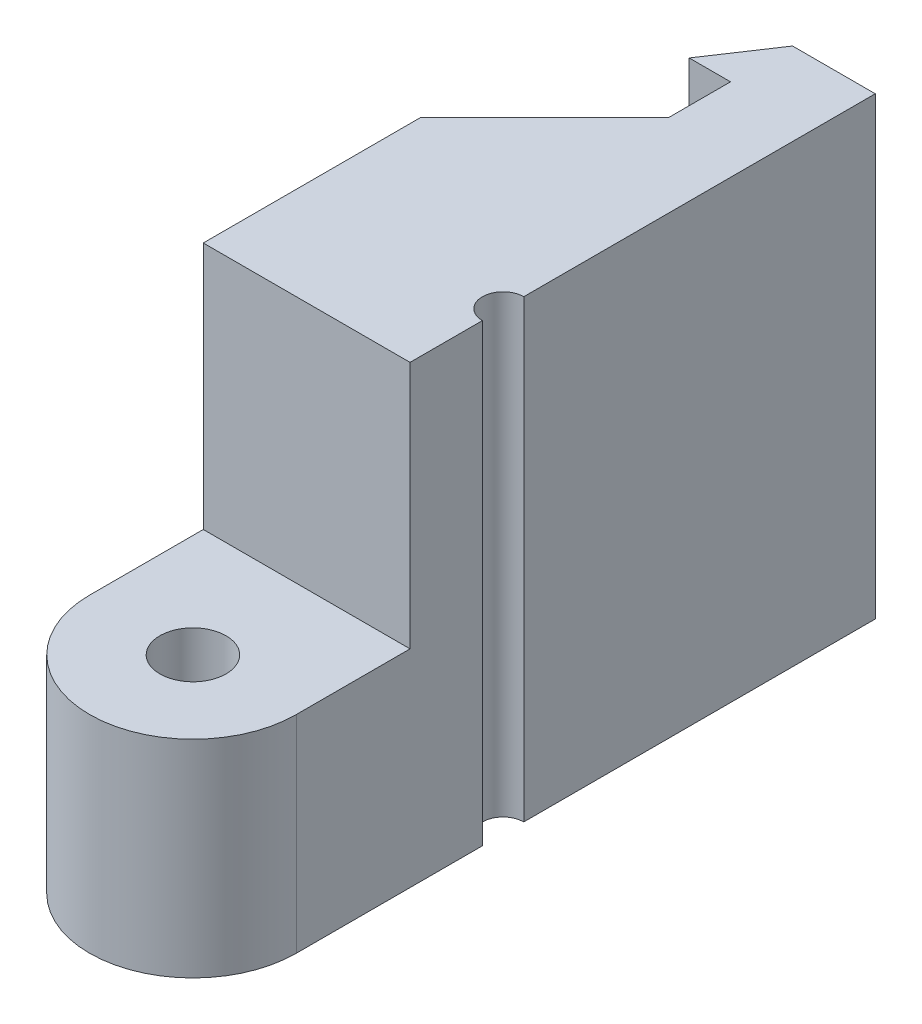
ISO-10303-21;
HEADER;
FILE_DESCRIPTION(('STEP AP214'),'2;1');
FILE_NAME('part.step','',(''),(''),'','','');
FILE_SCHEMA(('AUTOMOTIVE_DESIGN { 1 0 10303 214 1 1 1 1 }'));
ENDSEC;
DATA;
#1=APPLICATION_CONTEXT('core data for automotive mechanical design processes');
#2=APPLICATION_PROTOCOL_DEFINITION('international standard','automotive_design',2000,#1);
#3=PRODUCT_CONTEXT('',#1,'mechanical');
#4=PRODUCT('Part','Part','',(#3));
#5=PRODUCT_RELATED_PRODUCT_CATEGORY('part','',(#4));
#6=PRODUCT_DEFINITION_FORMATION('','',#4);
#7=PRODUCT_DEFINITION_CONTEXT('part definition',#1,'design');
#8=PRODUCT_DEFINITION('design','',#6,#7);
#9=PRODUCT_DEFINITION_SHAPE('','',#8);
#10=(LENGTH_UNIT() NAMED_UNIT(*) SI_UNIT(.MILLI.,.METRE.));
#11=(NAMED_UNIT(*) PLANE_ANGLE_UNIT() SI_UNIT($,.RADIAN.));
#12=(NAMED_UNIT(*) SI_UNIT($,.STERADIAN.) SOLID_ANGLE_UNIT());
#13=UNCERTAINTY_MEASURE_WITH_UNIT(LENGTH_MEASURE(1.E-05),#10,'distance_accuracy_value','');
#14=(GEOMETRIC_REPRESENTATION_CONTEXT(3) GLOBAL_UNCERTAINTY_ASSIGNED_CONTEXT((#13)) GLOBAL_UNIT_ASSIGNED_CONTEXT((#10,
#11,#12)) REPRESENTATION_CONTEXT('',''));
#15=CARTESIAN_POINT('',(0.,0.,0.));
#16=DIRECTION('',(0.,0.,1.));
#17=DIRECTION('',(1.,0.,0.));
#18=AXIS2_PLACEMENT_3D('',#15,#16,#17);
#19=CARTESIAN_POINT('',(5.,10.,-10.));
#20=DIRECTION('',(0.,-1.,0.));
#21=DIRECTION('',(0.,0.,-1.));
#22=AXIS2_PLACEMENT_3D('',#19,#20,#21);
#23=CYLINDRICAL_SURFACE('',#22,0.999999999999997);
#24=CARTESIAN_POINT('',(5.,0.,-10.));
#25=DIRECTION('',(0.,1.,0.));
#26=DIRECTION('',(0.,0.,1.));
#27=AXIS2_PLACEMENT_3D('',#24,#25,#26);
#28=CIRCLE('',#27,0.999999999999997);
#29=CARTESIAN_POINT('',(5.,0.,-11.));
#30=VERTEX_POINT('',#29);
#31=CARTESIAN_POINT('',(5.,0.,-9.));
#32=VERTEX_POINT('',#31);
#33=EDGE_CURVE('E194',#30,#32,#28,.T.);
#34=ORIENTED_EDGE('',*,*,#33,.F.);
#35=DIRECTION('',(0.,-1.,0.));
#36=VECTOR('',#35,1.);
#37=CARTESIAN_POINT('',(5.,10.,-11.));
#38=LINE('',#37,#36);
#39=CARTESIAN_POINT('',(5.,22.,-11.));
#40=VERTEX_POINT('',#39);
#41=EDGE_CURVE('E226',#40,#30,#38,.T.);
#42=ORIENTED_EDGE('',*,*,#41,.F.);
#43=CARTESIAN_POINT('',(5.,22.,-10.));
#44=DIRECTION('',(0.,-1.,0.));
#45=DIRECTION('',(0.,0.,1.));
#46=AXIS2_PLACEMENT_3D('',#43,#44,#45);
#47=CIRCLE('',#46,0.999999999999997);
#48=CARTESIAN_POINT('',(5.,22.,-9.));
#49=VERTEX_POINT('',#48);
#50=EDGE_CURVE('E142',#49,#40,#47,.T.);
#51=ORIENTED_EDGE('',*,*,#50,.F.);
#52=DIRECTION('',(0.,-1.,0.));
#53=VECTOR('',#52,1.);
#54=CARTESIAN_POINT('',(5.,10.,-9.));
#55=LINE('',#54,#53);
#56=EDGE_CURVE('E206',#49,#32,#55,.T.);
#57=ORIENTED_EDGE('',*,*,#56,.T.);
#58=EDGE_LOOP('',(#34,#42,#51,#57));
#59=FACE_BOUND('',#58,.T.);
#60=ADVANCED_FACE('F45',(#59),#23,.F.);
#61=CARTESIAN_POINT('',(5.,10.,0.));
#62=DIRECTION('',(-1.,0.,0.));
#63=DIRECTION('',(0.,0.,1.));
#64=AXIS2_PLACEMENT_3D('',#61,#62,#63);
#65=PLANE('',#64);
#66=DIRECTION('',(0.,0.,-1.));
#67=VECTOR('',#66,1.);
#68=CARTESIAN_POINT('',(5.,0.,0.));
#69=LINE('',#68,#67);
#70=CARTESIAN_POINT('',(5.,0.,-28.));
#71=VERTEX_POINT('',#70);
#72=EDGE_CURVE('E150',#30,#71,#69,.T.);
#73=ORIENTED_EDGE('',*,*,#72,.T.);
#74=DIRECTION('',(0.,1.,0.));
#75=VECTOR('',#74,1.);
#76=CARTESIAN_POINT('',(5.,-8.48528137423857,-28.));
#77=LINE('',#76,#75);
#78=CARTESIAN_POINT('',(5.,22.,-28.));
#79=VERTEX_POINT('',#78);
#80=EDGE_CURVE('E147',#71,#79,#77,.T.);
#81=ORIENTED_EDGE('',*,*,#80,.T.);
#82=DIRECTION('',(0.,0.,-1.));
#83=VECTOR('',#82,1.);
#84=CARTESIAN_POINT('',(5.,22.,-11.));
#85=LINE('',#84,#83);
#86=EDGE_CURVE('E134',#40,#79,#85,.T.);
#87=ORIENTED_EDGE('',*,*,#86,.F.);
#88=ORIENTED_EDGE('',*,*,#41,.T.);
#89=EDGE_LOOP('',(#73,#81,#87,#88));
#90=FACE_BOUND('',#89,.T.);
#91=ADVANCED_FACE('F148',(#90),#65,.F.);
#92=CARTESIAN_POINT('',(-5.,10.,0.));
#93=DIRECTION('',(-1.,0.,0.));
#94=DIRECTION('',(0.,0.,1.));
#95=AXIS2_PLACEMENT_3D('',#92,#93,#94);
#96=PLANE('',#95);
#97=DIRECTION('',(0.,0.,1.));
#98=VECTOR('',#97,1.);
#99=CARTESIAN_POINT('',(-5.,22.,-5.5));
#100=LINE('',#99,#98);
#101=CARTESIAN_POINT('',(-5.,22.,-16.));
#102=VERTEX_POINT('',#101);
#103=CARTESIAN_POINT('',(-5.,22.,-5.5));
#104=VERTEX_POINT('',#103);
#105=EDGE_CURVE('E144',#102,#104,#100,.T.);
#106=ORIENTED_EDGE('',*,*,#105,.F.);
#107=DIRECTION('',(0.,-1.,0.));
#108=VECTOR('',#107,1.);
#109=CARTESIAN_POINT('',(-5.,10.,-16.));
#110=LINE('',#109,#108);
#111=CARTESIAN_POINT('',(-5.,0.,-16.));
#112=VERTEX_POINT('',#111);
#113=EDGE_CURVE('E228',#102,#112,#110,.T.);
#114=ORIENTED_EDGE('',*,*,#113,.T.);
#115=DIRECTION('',(0.,0.,-1.));
#116=VECTOR('',#115,1.);
#117=CARTESIAN_POINT('',(-5.,0.,0.));
#118=LINE('',#117,#116);
#119=CARTESIAN_POINT('',(-5.,0.,0.));
#120=VERTEX_POINT('',#119);
#121=EDGE_CURVE('E210',#120,#112,#118,.T.);
#122=ORIENTED_EDGE('',*,*,#121,.F.);
#123=DIRECTION('',(0.,-1.,0.));
#124=VECTOR('',#123,1.);
#125=CARTESIAN_POINT('',(-5.,10.,0.));
#126=LINE('',#125,#124);
#127=CARTESIAN_POINT('',(-5.,10.,0.));
#128=VERTEX_POINT('',#127);
#129=EDGE_CURVE('E224',#128,#120,#126,.T.);
#130=ORIENTED_EDGE('',*,*,#129,.F.);
#131=DIRECTION('',(0.,0.,-1.));
#132=VECTOR('',#131,1.);
#133=CARTESIAN_POINT('',(-5.,10.,0.));
#134=LINE('',#133,#132);
#135=CARTESIAN_POINT('',(-5.,10.,-5.5));
#136=VERTEX_POINT('',#135);
#137=EDGE_CURVE('E195',#128,#136,#134,.T.);
#138=ORIENTED_EDGE('',*,*,#137,.T.);
#139=DIRECTION('',(0.,-1.,0.));
#140=VECTOR('',#139,1.);
#141=CARTESIAN_POINT('',(-5.,22.,-5.5));
#142=LINE('',#141,#140);
#143=EDGE_CURVE('E191',#104,#136,#142,.T.);
#144=ORIENTED_EDGE('',*,*,#143,.F.);
#145=EDGE_LOOP('',(#106,#114,#122,#130,#138,#144));
#146=FACE_BOUND('',#145,.T.);
#147=ADVANCED_FACE('F242',(#146),#96,.T.);
#148=CARTESIAN_POINT('',(0.,10.,0.));
#149=DIRECTION('',(0.,-1.,0.));
#150=DIRECTION('',(0.,0.,-1.));
#151=AXIS2_PLACEMENT_3D('',#148,#149,#150);
#152=CYLINDRICAL_SURFACE('',#151,5.);
#153=CARTESIAN_POINT('',(0.,0.,0.));
#154=DIRECTION('',(0.,1.,0.));
#155=DIRECTION('',(0.,0.,1.));
#156=AXIS2_PLACEMENT_3D('',#153,#154,#155);
#157=CIRCLE('',#156,5.);
#158=CARTESIAN_POINT('',(5.,0.,0.));
#159=VERTEX_POINT('',#158);
#160=EDGE_CURVE('E213',#120,#159,#157,.T.);
#161=ORIENTED_EDGE('',*,*,#160,.T.);
#162=DIRECTION('',(0.,-1.,0.));
#163=VECTOR('',#162,1.);
#164=CARTESIAN_POINT('',(5.,10.,0.));
#165=LINE('',#164,#163);
#166=CARTESIAN_POINT('',(5.,10.,0.));
#167=VERTEX_POINT('',#166);
#168=EDGE_CURVE('E221',#167,#159,#165,.T.);
#169=ORIENTED_EDGE('',*,*,#168,.F.);
#170=CARTESIAN_POINT('',(0.,10.,0.));
#171=DIRECTION('',(0.,1.,0.));
#172=DIRECTION('',(0.,0.,1.));
#173=AXIS2_PLACEMENT_3D('',#170,#171,#172);
#174=CIRCLE('',#173,5.);
#175=EDGE_CURVE('E198',#128,#167,#174,.T.);
#176=ORIENTED_EDGE('',*,*,#175,.F.);
#177=ORIENTED_EDGE('',*,*,#129,.T.);
#178=EDGE_LOOP('',(#161,#169,#176,#177));
#179=FACE_BOUND('',#178,.T.);
#180=ADVANCED_FACE('F283',(#179),#152,.T.);
#181=CARTESIAN_POINT('',(5.,10.,0.));
#182=DIRECTION('',(-1.,0.,0.));
#183=DIRECTION('',(0.,0.,1.));
#184=AXIS2_PLACEMENT_3D('',#181,#182,#183);
#185=PLANE('',#184);
#186=DIRECTION('',(0.,0.,-1.));
#187=VECTOR('',#186,1.);
#188=CARTESIAN_POINT('',(5.,0.,0.));
#189=LINE('',#188,#187);
#190=EDGE_CURVE('E215',#159,#32,#189,.T.);
#191=ORIENTED_EDGE('',*,*,#190,.T.);
#192=ORIENTED_EDGE('',*,*,#56,.F.);
#193=DIRECTION('',(0.,0.,-1.));
#194=VECTOR('',#193,1.);
#195=CARTESIAN_POINT('',(5.,22.,-5.5));
#196=LINE('',#195,#194);
#197=CARTESIAN_POINT('',(5.,22.,-5.5));
#198=VERTEX_POINT('',#197);
#199=EDGE_CURVE('E179',#198,#49,#196,.T.);
#200=ORIENTED_EDGE('',*,*,#199,.F.);
#201=DIRECTION('',(0.,-1.,0.));
#202=VECTOR('',#201,1.);
#203=CARTESIAN_POINT('',(5.,22.,-5.5));
#204=LINE('',#203,#202);
#205=CARTESIAN_POINT('',(5.,10.,-5.5));
#206=VERTEX_POINT('',#205);
#207=EDGE_CURVE('E186',#198,#206,#204,.T.);
#208=ORIENTED_EDGE('',*,*,#207,.T.);
#209=DIRECTION('',(0.,0.,-1.));
#210=VECTOR('',#209,1.);
#211=CARTESIAN_POINT('',(5.,10.,0.));
#212=LINE('',#211,#210);
#213=EDGE_CURVE('E201',#167,#206,#212,.T.);
#214=ORIENTED_EDGE('',*,*,#213,.F.);
#215=ORIENTED_EDGE('',*,*,#168,.T.);
#216=EDGE_LOOP('',(#191,#192,#200,#208,#214,#215));
#217=FACE_BOUND('',#216,.T.);
#218=ADVANCED_FACE('F251',(#217),#185,.F.);
#219=CARTESIAN_POINT('',(0.,10.,0.));
#220=DIRECTION('',(0.,-1.,0.));
#221=DIRECTION('',(0.,0.,-1.));
#222=AXIS2_PLACEMENT_3D('',#219,#220,#221);
#223=CYLINDRICAL_SURFACE('',#222,1.6);
#224=CARTESIAN_POINT('',(0.,10.,0.));
#225=DIRECTION('',(0.,1.,0.));
#226=DIRECTION('',(0.,0.,1.));
#227=AXIS2_PLACEMENT_3D('',#224,#225,#226);
#228=CIRCLE('',#227,1.6);
#229=CARTESIAN_POINT('',(0.,10.,1.6));
#230=VERTEX_POINT('',#229);
#231=EDGE_CURVE('E203',#230,#230,#228,.T.);
#232=ORIENTED_EDGE('',*,*,#231,.T.);
#233=EDGE_LOOP('',(#232));
#234=FACE_BOUND('',#233,.T.);
#235=CARTESIAN_POINT('',(0.,0.,0.));
#236=DIRECTION('',(0.,1.,0.));
#237=DIRECTION('',(0.,0.,1.));
#238=AXIS2_PLACEMENT_3D('',#235,#236,#237);
#239=CIRCLE('',#238,1.6);
#240=CARTESIAN_POINT('',(0.,0.,1.6));
#241=VERTEX_POINT('',#240);
#242=EDGE_CURVE('E199',#241,#241,#239,.T.);
#243=ORIENTED_EDGE('',*,*,#242,.F.);
#244=EDGE_LOOP('',(#243));
#245=FACE_BOUND('',#244,.T.);
#246=ADVANCED_FACE('F288',(#234,#245),#223,.F.);
#247=CARTESIAN_POINT('',(0.,10.,0.));
#248=DIRECTION('',(0.,1.,0.));
#249=DIRECTION('',(0.,0.,1.));
#250=AXIS2_PLACEMENT_3D('',#247,#248,#249);
#251=PLANE('',#250);
#252=DIRECTION('',(1.,0.,0.));
#253=VECTOR('',#252,1.);
#254=CARTESIAN_POINT('',(5.,10.,-5.5));
#255=LINE('',#254,#253);
#256=EDGE_CURVE('E181',#136,#206,#255,.T.);
#257=ORIENTED_EDGE('',*,*,#256,.F.);
#258=ORIENTED_EDGE('',*,*,#137,.F.);
#259=ORIENTED_EDGE('',*,*,#175,.T.);
#260=ORIENTED_EDGE('',*,*,#213,.T.);
#261=EDGE_LOOP('',(#257,#258,#259,#260));
#262=FACE_BOUND('',#261,.T.);
#263=ORIENTED_EDGE('',*,*,#231,.F.);
#264=EDGE_LOOP('',(#263));
#265=FACE_BOUND('',#264,.T.);
#266=ADVANCED_FACE('F290',(#262,#265),#251,.T.);
#267=CARTESIAN_POINT('',(0.,0.,0.));
#268=DIRECTION('',(0.,1.,0.));
#269=DIRECTION('',(0.,0.,1.));
#270=AXIS2_PLACEMENT_3D('',#267,#268,#269);
#271=PLANE('',#270);
#272=ORIENTED_EDGE('',*,*,#121,.T.);
#273=DIRECTION('',(-0.707106781186549,0.,0.707106781186546));
#274=VECTOR('',#273,1.);
#275=CARTESIAN_POINT('',(-5.,0.,-16.));
#276=LINE('',#275,#274);
#277=CARTESIAN_POINT('',(1.,0.,-22.));
#278=VERTEX_POINT('',#277);
#279=EDGE_CURVE('E54',#112,#278,#276,.F.);
#280=ORIENTED_EDGE('',*,*,#279,.T.);
#281=DIRECTION('',(0.,0.,-1.));
#282=VECTOR('',#281,1.);
#283=CARTESIAN_POINT('',(0.999999999999999,0.,-25.));
#284=LINE('',#283,#282);
#285=CARTESIAN_POINT('',(0.999999999999999,0.,-25.));
#286=VERTEX_POINT('',#285);
#287=EDGE_CURVE('E165',#278,#286,#284,.T.);
#288=ORIENTED_EDGE('',*,*,#287,.T.);
#289=DIRECTION('',(-1.,0.,0.));
#290=VECTOR('',#289,1.);
#291=CARTESIAN_POINT('',(-1.,0.,-25.));
#292=LINE('',#291,#290);
#293=CARTESIAN_POINT('',(-1.,0.,-25.));
#294=VERTEX_POINT('',#293);
#295=EDGE_CURVE('E240',#286,#294,#292,.T.);
#296=ORIENTED_EDGE('',*,*,#295,.T.);
#297=DIRECTION('',(0.554700196225229,0.,-0.832050294337844));
#298=VECTOR('',#297,1.);
#299=CARTESIAN_POINT('',(0.999999999999999,0.,-28.));
#300=LINE('',#299,#298);
#301=CARTESIAN_POINT('',(0.999999999999999,0.,-28.));
#302=VERTEX_POINT('',#301);
#303=EDGE_CURVE('E256',#294,#302,#300,.T.);
#304=ORIENTED_EDGE('',*,*,#303,.T.);
#305=DIRECTION('',(1.,0.,0.));
#306=VECTOR('',#305,1.);
#307=CARTESIAN_POINT('',(5.,0.,-28.));
#308=LINE('',#307,#306);
#309=EDGE_CURVE('E173',#302,#71,#308,.T.);
#310=ORIENTED_EDGE('',*,*,#309,.T.);
#311=ORIENTED_EDGE('',*,*,#72,.F.);
#312=ORIENTED_EDGE('',*,*,#33,.T.);
#313=ORIENTED_EDGE('',*,*,#190,.F.);
#314=ORIENTED_EDGE('',*,*,#160,.F.);
#315=EDGE_LOOP('',(#272,#280,#288,#296,#304,#310,#311,#312,#313,#314));
#316=FACE_BOUND('',#315,.T.);
#317=ORIENTED_EDGE('',*,*,#242,.T.);
#318=EDGE_LOOP('',(#317));
#319=FACE_BOUND('',#318,.T.);
#320=ADVANCED_FACE('F231',(#316,#319),#271,.F.);
#321=CARTESIAN_POINT('',(5.,22.,-5.5));
#322=DIRECTION('',(0.,0.,-1.));
#323=DIRECTION('',(-1.,0.,0.));
#324=AXIS2_PLACEMENT_3D('',#321,#322,#323);
#325=PLANE('',#324);
#326=ORIENTED_EDGE('',*,*,#256,.T.);
#327=ORIENTED_EDGE('',*,*,#207,.F.);
#328=DIRECTION('',(1.,0.,0.));
#329=VECTOR('',#328,1.);
#330=CARTESIAN_POINT('',(5.,22.,-5.5));
#331=LINE('',#330,#329);
#332=EDGE_CURVE('E184',#104,#198,#331,.T.);
#333=ORIENTED_EDGE('',*,*,#332,.F.);
#334=ORIENTED_EDGE('',*,*,#143,.T.);
#335=EDGE_LOOP('',(#326,#327,#333,#334));
#336=FACE_BOUND('',#335,.T.);
#337=ADVANCED_FACE('F248',(#336),#325,.F.);
#338=CARTESIAN_POINT('',(5.,22.,-10.));
#339=DIRECTION('',(0.,1.,0.));
#340=DIRECTION('',(0.,0.,1.));
#341=AXIS2_PLACEMENT_3D('',#338,#339,#340);
#342=PLANE('',#341);
#343=DIRECTION('',(0.,0.,1.));
#344=VECTOR('',#343,1.);
#345=CARTESIAN_POINT('',(0.999999999999999,22.,-25.));
#346=LINE('',#345,#344);
#347=CARTESIAN_POINT('',(0.999999999999999,22.,-25.));
#348=VERTEX_POINT('',#347);
#349=CARTESIAN_POINT('',(1.,22.,-22.));
#350=VERTEX_POINT('',#349);
#351=EDGE_CURVE('E155',#348,#350,#346,.T.);
#352=ORIENTED_EDGE('',*,*,#351,.T.);
#353=DIRECTION('',(0.707106781186549,0.,-0.707106781186546));
#354=VECTOR('',#353,1.);
#355=CARTESIAN_POINT('',(-2.99999999999998,22.,-18.));
#356=LINE('',#355,#354);
#357=EDGE_CURVE('E11',#350,#102,#356,.F.);
#358=ORIENTED_EDGE('',*,*,#357,.T.);
#359=ORIENTED_EDGE('',*,*,#105,.T.);
#360=ORIENTED_EDGE('',*,*,#332,.T.);
#361=ORIENTED_EDGE('',*,*,#199,.T.);
#362=ORIENTED_EDGE('',*,*,#50,.T.);
#363=ORIENTED_EDGE('',*,*,#86,.T.);
#364=DIRECTION('',(-1.,0.,0.));
#365=VECTOR('',#364,1.);
#366=CARTESIAN_POINT('',(5.,22.,-28.));
#367=LINE('',#366,#365);
#368=CARTESIAN_POINT('',(0.999999999999999,22.,-28.));
#369=VERTEX_POINT('',#368);
#370=EDGE_CURVE('E139',#79,#369,#367,.T.);
#371=ORIENTED_EDGE('',*,*,#370,.T.);
#372=DIRECTION('',(-0.554700196225229,0.,0.832050294337844));
#373=VECTOR('',#372,1.);
#374=CARTESIAN_POINT('',(0.999999999999999,22.,-28.));
#375=LINE('',#374,#373);
#376=CARTESIAN_POINT('',(-1.,22.,-25.));
#377=VERTEX_POINT('',#376);
#378=EDGE_CURVE('E160',#369,#377,#375,.T.);
#379=ORIENTED_EDGE('',*,*,#378,.T.);
#380=DIRECTION('',(1.,0.,0.));
#381=VECTOR('',#380,1.);
#382=CARTESIAN_POINT('',(-1.,22.,-25.));
#383=LINE('',#382,#381);
#384=EDGE_CURVE('E162',#377,#348,#383,.T.);
#385=ORIENTED_EDGE('',*,*,#384,.T.);
#386=EDGE_LOOP('',(#352,#358,#359,#360,#361,#362,#363,#371,#379,#385));
#387=FACE_BOUND('',#386,.T.);
#388=ADVANCED_FACE('F136',(#387),#342,.T.);
#389=CARTESIAN_POINT('',(0.999999999999999,-8.48528137423857,-25.));
#390=DIRECTION('',(-1.,0.,0.));
#391=DIRECTION('',(0.,0.,1.));
#392=AXIS2_PLACEMENT_3D('',#389,#390,#391);
#393=PLANE('',#392);
#394=ORIENTED_EDGE('',*,*,#287,.F.);
#395=DIRECTION('',(0.,1.,0.));
#396=VECTOR('',#395,1.);
#397=CARTESIAN_POINT('',(1.,-8.48528137423857,-22.));
#398=LINE('',#397,#396);
#399=EDGE_CURVE('E171',#278,#350,#398,.T.);
#400=ORIENTED_EDGE('',*,*,#399,.T.);
#401=ORIENTED_EDGE('',*,*,#351,.F.);
#402=DIRECTION('',(0.,1.,0.));
#403=VECTOR('',#402,1.);
#404=CARTESIAN_POINT('',(0.999999999999999,-8.48528137423857,-25.));
#405=LINE('',#404,#403);
#406=EDGE_CURVE('E174',#286,#348,#405,.T.);
#407=ORIENTED_EDGE('',*,*,#406,.F.);
#408=EDGE_LOOP('',(#394,#400,#401,#407));
#409=FACE_BOUND('',#408,.T.);
#410=ADVANCED_FACE('F238',(#409),#393,.T.);
#411=CARTESIAN_POINT('',(-1.,-8.48528137423857,-25.));
#412=DIRECTION('',(0.,0.,1.));
#413=DIRECTION('',(1.,0.,0.));
#414=AXIS2_PLACEMENT_3D('',#411,#412,#413);
#415=PLANE('',#414);
#416=ORIENTED_EDGE('',*,*,#295,.F.);
#417=ORIENTED_EDGE('',*,*,#406,.T.);
#418=ORIENTED_EDGE('',*,*,#384,.F.);
#419=DIRECTION('',(0.,1.,0.));
#420=VECTOR('',#419,1.);
#421=CARTESIAN_POINT('',(-1.,-8.48528137423857,-25.));
#422=LINE('',#421,#420);
#423=EDGE_CURVE('E176',#294,#377,#422,.T.);
#424=ORIENTED_EDGE('',*,*,#423,.F.);
#425=EDGE_LOOP('',(#416,#417,#418,#424));
#426=FACE_BOUND('',#425,.T.);
#427=ADVANCED_FACE('F264',(#426),#415,.T.);
#428=CARTESIAN_POINT('',(0.999999999999999,-8.48528137423857,-28.));
#429=DIRECTION('',(-0.832050294337844,0.,-0.554700196225229));
#430=DIRECTION('',(-0.554700196225229,0.,0.832050294337844));
#431=AXIS2_PLACEMENT_3D('',#428,#429,#430);
#432=PLANE('',#431);
#433=ORIENTED_EDGE('',*,*,#303,.F.);
#434=ORIENTED_EDGE('',*,*,#423,.T.);
#435=ORIENTED_EDGE('',*,*,#378,.F.);
#436=DIRECTION('',(0.,1.,0.));
#437=VECTOR('',#436,1.);
#438=CARTESIAN_POINT('',(0.999999999999999,-8.48528137423857,-28.));
#439=LINE('',#438,#437);
#440=EDGE_CURVE('E154',#302,#369,#439,.T.);
#441=ORIENTED_EDGE('',*,*,#440,.F.);
#442=EDGE_LOOP('',(#433,#434,#435,#441));
#443=FACE_BOUND('',#442,.T.);
#444=ADVANCED_FACE('F262',(#443),#432,.T.);
#445=CARTESIAN_POINT('',(5.,-8.48528137423857,-28.));
#446=DIRECTION('',(0.,0.,-1.));
#447=DIRECTION('',(-1.,0.,0.));
#448=AXIS2_PLACEMENT_3D('',#445,#446,#447);
#449=PLANE('',#448);
#450=ORIENTED_EDGE('',*,*,#309,.F.);
#451=ORIENTED_EDGE('',*,*,#440,.T.);
#452=ORIENTED_EDGE('',*,*,#370,.F.);
#453=ORIENTED_EDGE('',*,*,#80,.F.);
#454=EDGE_LOOP('',(#450,#451,#452,#453));
#455=FACE_BOUND('',#454,.T.);
#456=ADVANCED_FACE('F157',(#455),#449,.T.);
#457=CARTESIAN_POINT('',(-5.,10.,-16.));
#458=DIRECTION('',(0.707106781186546,0.,0.707106781186549));
#459=DIRECTION('',(0.,-1.,0.));
#460=AXIS2_PLACEMENT_3D('',#457,#458,#459);
#461=PLANE('',#460);
#462=ORIENTED_EDGE('',*,*,#357,.F.);
#463=ORIENTED_EDGE('',*,*,#399,.F.);
#464=ORIENTED_EDGE('',*,*,#279,.F.);
#465=ORIENTED_EDGE('',*,*,#113,.F.);
#466=EDGE_LOOP('',(#462,#463,#464,#465));
#467=FACE_BOUND('',#466,.T.);
#468=ADVANCED_FACE('F48',(#467),#461,.F.);
#469=CLOSED_SHELL('',(#60,#91,#147,#180,#218,#246,#266,#320,#337,#388,#410,#427,#444,#456,#468));
#470=MANIFOLD_SOLID_BREP('B2',#469);
#471=ADVANCED_BREP_SHAPE_REPRESENTATION('',(#18,#470),#14);
#472=SHAPE_DEFINITION_REPRESENTATION(#9,#471);
ENDSEC;
END-ISO-10303-21;
